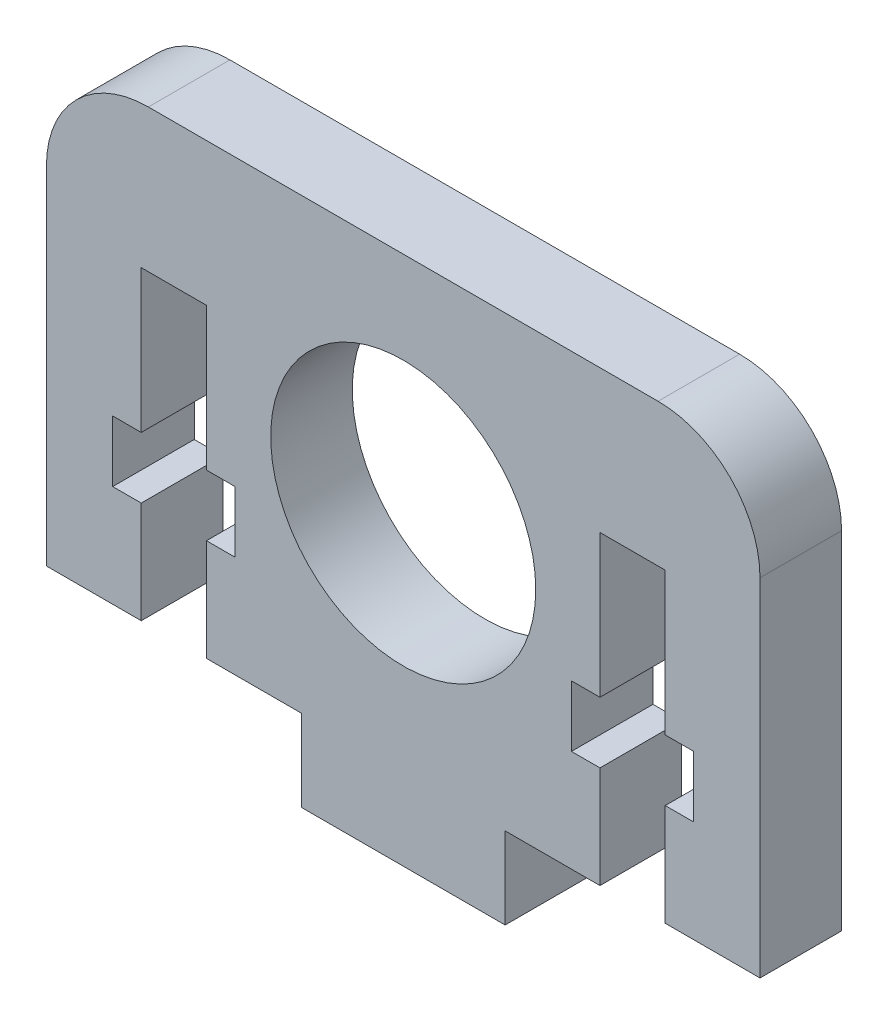
ISO-10303-21;
HEADER;
FILE_DESCRIPTION(('STEP AP214'),'2;1');
FILE_NAME('part.step','',(''),(''),'','','');
FILE_SCHEMA(('AUTOMOTIVE_DESIGN { 1 0 10303 214 1 1 1 1 }'));
ENDSEC;
DATA;
#1=APPLICATION_CONTEXT('core data for automotive mechanical design processes');
#2=APPLICATION_PROTOCOL_DEFINITION('international standard','automotive_design',2000,#1);
#3=PRODUCT_CONTEXT('',#1,'mechanical');
#4=PRODUCT('Part','Part','',(#3));
#5=PRODUCT_RELATED_PRODUCT_CATEGORY('part','',(#4));
#6=PRODUCT_DEFINITION_FORMATION('','',#4);
#7=PRODUCT_DEFINITION_CONTEXT('part definition',#1,'design');
#8=PRODUCT_DEFINITION('design','',#6,#7);
#9=PRODUCT_DEFINITION_SHAPE('','',#8);
#10=(LENGTH_UNIT() NAMED_UNIT(*) SI_UNIT(.MILLI.,.METRE.));
#11=(NAMED_UNIT(*) PLANE_ANGLE_UNIT() SI_UNIT($,.RADIAN.));
#12=(NAMED_UNIT(*) SI_UNIT($,.STERADIAN.) SOLID_ANGLE_UNIT());
#13=UNCERTAINTY_MEASURE_WITH_UNIT(LENGTH_MEASURE(1.E-05),#10,'distance_accuracy_value','');
#14=(GEOMETRIC_REPRESENTATION_CONTEXT(3) GLOBAL_UNCERTAINTY_ASSIGNED_CONTEXT((#13)) GLOBAL_UNIT_ASSIGNED_CONTEXT((#10,
#11,#12)) REPRESENTATION_CONTEXT('',''));
#15=CARTESIAN_POINT('',(0.,0.,0.));
#16=DIRECTION('',(0.,0.,1.));
#17=DIRECTION('',(1.,0.,0.));
#18=AXIS2_PLACEMENT_3D('',#15,#16,#17);
#19=CARTESIAN_POINT('',(-17.5,-11.,4.));
#20=DIRECTION('',(0.,1.,0.));
#21=DIRECTION('',(-1.,0.,0.));
#22=AXIS2_PLACEMENT_3D('',#19,#20,#21);
#23=PLANE('',#22);
#24=DIRECTION('',(1.,0.,0.));
#25=VECTOR('',#24,1.);
#26=CARTESIAN_POINT('',(-17.5,-11.,4.));
#27=LINE('',#26,#25);
#28=CARTESIAN_POINT('',(-9.64999999999999,-11.,4.));
#29=VERTEX_POINT('',#28);
#30=CARTESIAN_POINT('',(-5.,-11.,4.));
#31=VERTEX_POINT('',#30);
#32=EDGE_CURVE('E464',#29,#31,#27,.T.);
#33=ORIENTED_EDGE('',*,*,#32,.F.);
#34=DIRECTION('',(0.,0.,1.));
#35=VECTOR('',#34,1.);
#36=CARTESIAN_POINT('',(-9.64999999999999,-11.,0.));
#37=LINE('',#36,#35);
#38=CARTESIAN_POINT('',(-9.64999999999999,-11.,0.));
#39=VERTEX_POINT('',#38);
#40=EDGE_CURVE('E315',#39,#29,#37,.T.);
#41=ORIENTED_EDGE('',*,*,#40,.F.);
#42=DIRECTION('',(1.,0.,0.));
#43=VECTOR('',#42,1.);
#44=CARTESIAN_POINT('',(-17.5,-11.,0.));
#45=LINE('',#44,#43);
#46=CARTESIAN_POINT('',(-5.,-11.,0.));
#47=VERTEX_POINT('',#46);
#48=EDGE_CURVE('E484',#39,#47,#45,.T.);
#49=ORIENTED_EDGE('',*,*,#48,.T.);
#50=DIRECTION('',(0.,0.,-1.));
#51=VECTOR('',#50,1.);
#52=CARTESIAN_POINT('',(-5.,-11.,4.));
#53=LINE('',#52,#51);
#54=EDGE_CURVE('E507',#31,#47,#53,.T.);
#55=ORIENTED_EDGE('',*,*,#54,.F.);
#56=EDGE_LOOP('',(#33,#41,#49,#55));
#57=FACE_BOUND('',#56,.T.);
#58=ADVANCED_FACE('F33',(#57),#23,.F.);
#59=CARTESIAN_POINT('',(5.,-11.,4.));
#60=DIRECTION('',(0.,1.,0.));
#61=DIRECTION('',(-1.,0.,0.));
#62=AXIS2_PLACEMENT_3D('',#59,#60,#61);
#63=PLANE('',#62);
#64=DIRECTION('',(1.,0.,0.));
#65=VECTOR('',#64,1.);
#66=CARTESIAN_POINT('',(5.,-11.,0.));
#67=LINE('',#66,#65);
#68=CARTESIAN_POINT('',(5.,-11.,0.));
#69=VERTEX_POINT('',#68);
#70=CARTESIAN_POINT('',(9.65,-11.,0.));
#71=VERTEX_POINT('',#70);
#72=EDGE_CURVE('E460',#69,#71,#67,.T.);
#73=ORIENTED_EDGE('',*,*,#72,.T.);
#74=DIRECTION('',(0.,0.,1.));
#75=VECTOR('',#74,1.);
#76=CARTESIAN_POINT('',(9.65,-11.,0.));
#77=LINE('',#76,#75);
#78=CARTESIAN_POINT('',(9.65,-11.,4.));
#79=VERTEX_POINT('',#78);
#80=EDGE_CURVE('E340',#71,#79,#77,.T.);
#81=ORIENTED_EDGE('',*,*,#80,.T.);
#82=DIRECTION('',(1.,0.,0.));
#83=VECTOR('',#82,1.);
#84=CARTESIAN_POINT('',(5.,-11.,4.));
#85=LINE('',#84,#83);
#86=CARTESIAN_POINT('',(5.,-11.,4.));
#87=VERTEX_POINT('',#86);
#88=EDGE_CURVE('E475',#87,#79,#85,.T.);
#89=ORIENTED_EDGE('',*,*,#88,.F.);
#90=DIRECTION('',(0.,0.,-1.));
#91=VECTOR('',#90,1.);
#92=CARTESIAN_POINT('',(5.,-11.,4.));
#93=LINE('',#92,#91);
#94=EDGE_CURVE('E498',#87,#69,#93,.T.);
#95=ORIENTED_EDGE('',*,*,#94,.T.);
#96=EDGE_LOOP('',(#73,#81,#89,#95));
#97=FACE_BOUND('',#96,.T.);
#98=ADVANCED_FACE('F586',(#97),#63,.F.);
#99=CARTESIAN_POINT('',(0.,0.,4.));
#100=DIRECTION('',(0.,0.,1.));
#101=DIRECTION('',(1.,0.,0.));
#102=AXIS2_PLACEMENT_3D('',#99,#100,#101);
#103=PLANE('',#102);
#104=DIRECTION('',(-1.,0.,0.));
#105=VECTOR('',#104,1.);
#106=CARTESIAN_POINT('',(-17.5,11.,4.));
#107=LINE('',#106,#105);
#108=CARTESIAN_POINT('',(12.5,11.,4.));
#109=VERTEX_POINT('',#108);
#110=CARTESIAN_POINT('',(-12.5,11.,4.));
#111=VERTEX_POINT('',#110);
#112=EDGE_CURVE('E459',#109,#111,#107,.T.);
#113=ORIENTED_EDGE('',*,*,#112,.T.);
#114=CARTESIAN_POINT('',(-12.5,6.,4.));
#115=DIRECTION('',(0.,0.,1.));
#116=DIRECTION('',(1.,0.,0.));
#117=AXIS2_PLACEMENT_3D('',#114,#115,#116);
#118=CIRCLE('',#117,5.);
#119=CARTESIAN_POINT('',(-17.5,6.,4.));
#120=VERTEX_POINT('',#119);
#121=EDGE_CURVE('E41',#111,#120,#118,.T.);
#122=ORIENTED_EDGE('',*,*,#121,.T.);
#123=DIRECTION('',(0.,-1.,0.));
#124=VECTOR('',#123,1.);
#125=CARTESIAN_POINT('',(-17.5,11.,4.));
#126=LINE('',#125,#124);
#127=CARTESIAN_POINT('',(-17.5,-11.,4.));
#128=VERTEX_POINT('',#127);
#129=EDGE_CURVE('E462',#120,#128,#126,.T.);
#130=ORIENTED_EDGE('',*,*,#129,.T.);
#131=CARTESIAN_POINT('',(-12.85,-11.,4.));
#132=VERTEX_POINT('',#131);
#133=EDGE_CURVE('E465',#128,#132,#27,.T.);
#134=ORIENTED_EDGE('',*,*,#133,.T.);
#135=DIRECTION('',(0.,-1.,0.));
#136=VECTOR('',#135,1.);
#137=CARTESIAN_POINT('',(-12.85,-11.,4.));
#138=LINE('',#137,#136);
#139=CARTESIAN_POINT('',(-12.85,-6.,4.));
#140=VERTEX_POINT('',#139);
#141=EDGE_CURVE('E366',#140,#132,#138,.T.);
#142=ORIENTED_EDGE('',*,*,#141,.F.);
#143=DIRECTION('',(1.,0.,0.));
#144=VECTOR('',#143,1.);
#145=CARTESIAN_POINT('',(-12.85,-6.,4.));
#146=LINE('',#145,#144);
#147=CARTESIAN_POINT('',(-14.25,-6.,4.));
#148=VERTEX_POINT('',#147);
#149=EDGE_CURVE('E424',#148,#140,#146,.T.);
#150=ORIENTED_EDGE('',*,*,#149,.F.);
#151=DIRECTION('',(0.,-1.,0.));
#152=VECTOR('',#151,1.);
#153=CARTESIAN_POINT('',(-14.25,-6.,4.));
#154=LINE('',#153,#152);
#155=CARTESIAN_POINT('',(-14.25,-3.,4.));
#156=VERTEX_POINT('',#155);
#157=EDGE_CURVE('E421',#156,#148,#154,.T.);
#158=ORIENTED_EDGE('',*,*,#157,.F.);
#159=DIRECTION('',(-1.,0.,0.));
#160=VECTOR('',#159,1.);
#161=CARTESIAN_POINT('',(-14.25,-3.,4.));
#162=LINE('',#161,#160);
#163=CARTESIAN_POINT('',(-12.85,-3.,4.));
#164=VERTEX_POINT('',#163);
#165=EDGE_CURVE('E418',#164,#156,#162,.T.);
#166=ORIENTED_EDGE('',*,*,#165,.F.);
#167=DIRECTION('',(0.,-1.,0.));
#168=VECTOR('',#167,1.);
#169=CARTESIAN_POINT('',(-12.85,-3.,4.));
#170=LINE('',#169,#168);
#171=CARTESIAN_POINT('',(-12.85,4.,4.));
#172=VERTEX_POINT('',#171);
#173=EDGE_CURVE('E415',#172,#164,#170,.T.);
#174=ORIENTED_EDGE('',*,*,#173,.F.);
#175=DIRECTION('',(-1.,0.,0.));
#176=VECTOR('',#175,1.);
#177=CARTESIAN_POINT('',(-12.85,4.,4.));
#178=LINE('',#177,#176);
#179=CARTESIAN_POINT('',(-9.65,4.,4.));
#180=VERTEX_POINT('',#179);
#181=EDGE_CURVE('E412',#180,#172,#178,.T.);
#182=ORIENTED_EDGE('',*,*,#181,.F.);
#183=DIRECTION('',(0.,1.,0.));
#184=VECTOR('',#183,1.);
#185=CARTESIAN_POINT('',(-9.64999999999999,-3.,4.));
#186=LINE('',#185,#184);
#187=CARTESIAN_POINT('',(-9.64999999999999,-3.,4.));
#188=VERTEX_POINT('',#187);
#189=EDGE_CURVE('E409',#188,#180,#186,.T.);
#190=ORIENTED_EDGE('',*,*,#189,.F.);
#191=DIRECTION('',(-1.,0.,0.));
#192=VECTOR('',#191,1.);
#193=CARTESIAN_POINT('',(-8.24999999999999,-3.,4.));
#194=LINE('',#193,#192);
#195=CARTESIAN_POINT('',(-8.24999999999999,-3.,4.));
#196=VERTEX_POINT('',#195);
#197=EDGE_CURVE('E406',#196,#188,#194,.T.);
#198=ORIENTED_EDGE('',*,*,#197,.F.);
#199=DIRECTION('',(0.,1.,0.));
#200=VECTOR('',#199,1.);
#201=CARTESIAN_POINT('',(-8.24999999999999,-6.,4.));
#202=LINE('',#201,#200);
#203=CARTESIAN_POINT('',(-8.24999999999999,-6.,4.));
#204=VERTEX_POINT('',#203);
#205=EDGE_CURVE('E403',#204,#196,#202,.T.);
#206=ORIENTED_EDGE('',*,*,#205,.F.);
#207=DIRECTION('',(1.,0.,0.));
#208=VECTOR('',#207,1.);
#209=CARTESIAN_POINT('',(-9.64999999999999,-6.,4.));
#210=LINE('',#209,#208);
#211=CARTESIAN_POINT('',(-9.64999999999999,-6.,4.));
#212=VERTEX_POINT('',#211);
#213=EDGE_CURVE('E400',#212,#204,#210,.T.);
#214=ORIENTED_EDGE('',*,*,#213,.F.);
#215=DIRECTION('',(0.,1.,0.));
#216=VECTOR('',#215,1.);
#217=CARTESIAN_POINT('',(-9.64999999999999,-11.,4.));
#218=LINE('',#217,#216);
#219=EDGE_CURVE('E397',#29,#212,#218,.T.);
#220=ORIENTED_EDGE('',*,*,#219,.F.);
#221=ORIENTED_EDGE('',*,*,#32,.T.);
#222=DIRECTION('',(0.,-1.,0.));
#223=VECTOR('',#222,1.);
#224=CARTESIAN_POINT('',(-5.,-11.,4.));
#225=LINE('',#224,#223);
#226=CARTESIAN_POINT('',(-5.,-15.,4.));
#227=VERTEX_POINT('',#226);
#228=EDGE_CURVE('E468',#31,#227,#225,.T.);
#229=ORIENTED_EDGE('',*,*,#228,.T.);
#230=DIRECTION('',(1.,0.,0.));
#231=VECTOR('',#230,1.);
#232=CARTESIAN_POINT('',(-5.,-15.,4.));
#233=LINE('',#232,#231);
#234=CARTESIAN_POINT('',(5.,-15.,4.));
#235=VERTEX_POINT('',#234);
#236=EDGE_CURVE('E470',#227,#235,#233,.T.);
#237=ORIENTED_EDGE('',*,*,#236,.T.);
#238=DIRECTION('',(0.,1.,0.));
#239=VECTOR('',#238,1.);
#240=CARTESIAN_POINT('',(5.,-11.,4.));
#241=LINE('',#240,#239);
#242=EDGE_CURVE('E472',#235,#87,#241,.T.);
#243=ORIENTED_EDGE('',*,*,#242,.T.);
#244=ORIENTED_EDGE('',*,*,#88,.T.);
#245=DIRECTION('',(0.,-1.,0.));
#246=VECTOR('',#245,1.);
#247=CARTESIAN_POINT('',(9.65,-11.,4.));
#248=LINE('',#247,#246);
#249=CARTESIAN_POINT('',(9.65,-6.,4.));
#250=VERTEX_POINT('',#249);
#251=EDGE_CURVE('E283',#250,#79,#248,.T.);
#252=ORIENTED_EDGE('',*,*,#251,.F.);
#253=DIRECTION('',(1.,0.,0.));
#254=VECTOR('',#253,1.);
#255=CARTESIAN_POINT('',(9.65,-6.,4.));
#256=LINE('',#255,#254);
#257=CARTESIAN_POINT('',(8.25,-6.,4.));
#258=VERTEX_POINT('',#257);
#259=EDGE_CURVE('E285',#258,#250,#256,.T.);
#260=ORIENTED_EDGE('',*,*,#259,.F.);
#261=DIRECTION('',(0.,-1.,0.));
#262=VECTOR('',#261,1.);
#263=CARTESIAN_POINT('',(8.25,-6.,4.));
#264=LINE('',#263,#262);
#265=CARTESIAN_POINT('',(8.25,-3.,4.));
#266=VERTEX_POINT('',#265);
#267=EDGE_CURVE('E335',#266,#258,#264,.T.);
#268=ORIENTED_EDGE('',*,*,#267,.F.);
#269=DIRECTION('',(-1.,0.,0.));
#270=VECTOR('',#269,1.);
#271=CARTESIAN_POINT('',(8.25,-3.,4.));
#272=LINE('',#271,#270);
#273=CARTESIAN_POINT('',(9.65,-3.,4.));
#274=VERTEX_POINT('',#273);
#275=EDGE_CURVE('E332',#274,#266,#272,.T.);
#276=ORIENTED_EDGE('',*,*,#275,.F.);
#277=DIRECTION('',(0.,-1.,0.));
#278=VECTOR('',#277,1.);
#279=CARTESIAN_POINT('',(9.65,-3.,4.));
#280=LINE('',#279,#278);
#281=CARTESIAN_POINT('',(9.65,4.,4.));
#282=VERTEX_POINT('',#281);
#283=EDGE_CURVE('E329',#282,#274,#280,.T.);
#284=ORIENTED_EDGE('',*,*,#283,.F.);
#285=DIRECTION('',(-1.,0.,0.));
#286=VECTOR('',#285,1.);
#287=CARTESIAN_POINT('',(12.85,4.,4.));
#288=LINE('',#287,#286);
#289=CARTESIAN_POINT('',(12.85,4.,4.));
#290=VERTEX_POINT('',#289);
#291=EDGE_CURVE('E326',#290,#282,#288,.T.);
#292=ORIENTED_EDGE('',*,*,#291,.F.);
#293=DIRECTION('',(0.,1.,0.));
#294=VECTOR('',#293,1.);
#295=CARTESIAN_POINT('',(12.85,-3.,4.));
#296=LINE('',#295,#294);
#297=CARTESIAN_POINT('',(12.85,-3.,4.));
#298=VERTEX_POINT('',#297);
#299=EDGE_CURVE('E323',#298,#290,#296,.T.);
#300=ORIENTED_EDGE('',*,*,#299,.F.);
#301=DIRECTION('',(-1.,0.,0.));
#302=VECTOR('',#301,1.);
#303=CARTESIAN_POINT('',(14.25,-3.,4.));
#304=LINE('',#303,#302);
#305=CARTESIAN_POINT('',(14.25,-3.,4.));
#306=VERTEX_POINT('',#305);
#307=EDGE_CURVE('E320',#306,#298,#304,.T.);
#308=ORIENTED_EDGE('',*,*,#307,.F.);
#309=DIRECTION('',(0.,1.,0.));
#310=VECTOR('',#309,1.);
#311=CARTESIAN_POINT('',(14.25,-6.,4.));
#312=LINE('',#311,#310);
#313=CARTESIAN_POINT('',(14.25,-6.,4.));
#314=VERTEX_POINT('',#313);
#315=EDGE_CURVE('E317',#314,#306,#312,.T.);
#316=ORIENTED_EDGE('',*,*,#315,.F.);
#317=DIRECTION('',(1.,0.,0.));
#318=VECTOR('',#317,1.);
#319=CARTESIAN_POINT('',(12.85,-6.,4.));
#320=LINE('',#319,#318);
#321=CARTESIAN_POINT('',(12.85,-6.,4.));
#322=VERTEX_POINT('',#321);
#323=EDGE_CURVE('E314',#322,#314,#320,.T.);
#324=ORIENTED_EDGE('',*,*,#323,.F.);
#325=DIRECTION('',(0.,1.,0.));
#326=VECTOR('',#325,1.);
#327=CARTESIAN_POINT('',(12.85,-11.,4.));
#328=LINE('',#327,#326);
#329=CARTESIAN_POINT('',(12.85,-11.,4.));
#330=VERTEX_POINT('',#329);
#331=EDGE_CURVE('E262',#330,#322,#328,.T.);
#332=ORIENTED_EDGE('',*,*,#331,.F.);
#333=CARTESIAN_POINT('',(17.5,-11.,4.));
#334=VERTEX_POINT('',#333);
#335=EDGE_CURVE('E474',#330,#334,#85,.T.);
#336=ORIENTED_EDGE('',*,*,#335,.T.);
#337=DIRECTION('',(0.,1.,0.));
#338=VECTOR('',#337,1.);
#339=CARTESIAN_POINT('',(17.5,11.,4.));
#340=LINE('',#339,#338);
#341=CARTESIAN_POINT('',(17.5,6.,4.));
#342=VERTEX_POINT('',#341);
#343=EDGE_CURVE('E457',#334,#342,#340,.T.);
#344=ORIENTED_EDGE('',*,*,#343,.T.);
#345=CARTESIAN_POINT('',(12.5,6.,4.));
#346=DIRECTION('',(0.,0.,1.));
#347=DIRECTION('',(1.,0.,0.));
#348=AXIS2_PLACEMENT_3D('',#345,#346,#347);
#349=CIRCLE('',#348,5.);
#350=EDGE_CURVE('E524',#342,#109,#349,.T.);
#351=ORIENTED_EDGE('',*,*,#350,.T.);
#352=EDGE_LOOP('',(#113,#122,#130,#134,#142,#150,#158,#166,#174,#182,#190,#198,#206,#214,#220,
#221,#229,#237,#243,#244,#252,#260,#268,#276,#284,#292,#300,#308,#316,#324,#332,#336,#344,#351));
#353=FACE_BOUND('',#352,.T.);
#354=CARTESIAN_POINT('',(0.,0.,4.));
#355=DIRECTION('',(0.,0.,1.));
#356=DIRECTION('',(1.,0.,0.));
#357=AXIS2_PLACEMENT_3D('',#354,#355,#356);
#358=CIRCLE('',#357,6.5);
#359=CARTESIAN_POINT('',(6.5,0.,4.));
#360=VERTEX_POINT('',#359);
#361=EDGE_CURVE('E451',#360,#360,#358,.T.);
#362=ORIENTED_EDGE('',*,*,#361,.F.);
#363=EDGE_LOOP('',(#362));
#364=FACE_BOUND('',#363,.T.);
#365=ADVANCED_FACE('F528',(#353,#364),#103,.T.);
#366=CARTESIAN_POINT('',(0.,0.,0.));
#367=DIRECTION('',(0.,0.,1.));
#368=DIRECTION('',(1.,0.,0.));
#369=AXIS2_PLACEMENT_3D('',#366,#367,#368);
#370=PLANE('',#369);
#371=DIRECTION('',(0.,-1.,0.));
#372=VECTOR('',#371,1.);
#373=CARTESIAN_POINT('',(-17.5,11.,0.));
#374=LINE('',#373,#372);
#375=CARTESIAN_POINT('',(-17.5,6.,0.));
#376=VERTEX_POINT('',#375);
#377=CARTESIAN_POINT('',(-17.5,-11.,0.));
#378=VERTEX_POINT('',#377);
#379=EDGE_CURVE('E482',#376,#378,#374,.T.);
#380=ORIENTED_EDGE('',*,*,#379,.F.);
#381=CARTESIAN_POINT('',(-12.5,6.,0.));
#382=DIRECTION('',(0.,0.,1.));
#383=DIRECTION('',(1.,0.,0.));
#384=AXIS2_PLACEMENT_3D('',#381,#382,#383);
#385=CIRCLE('',#384,5.);
#386=CARTESIAN_POINT('',(-12.5,11.,0.));
#387=VERTEX_POINT('',#386);
#388=EDGE_CURVE('E518',#376,#387,#385,.F.);
#389=ORIENTED_EDGE('',*,*,#388,.T.);
#390=DIRECTION('',(-1.,0.,0.));
#391=VECTOR('',#390,1.);
#392=CARTESIAN_POINT('',(-17.5,11.,0.));
#393=LINE('',#392,#391);
#394=CARTESIAN_POINT('',(12.5,11.,0.));
#395=VERTEX_POINT('',#394);
#396=EDGE_CURVE('E480',#395,#387,#393,.T.);
#397=ORIENTED_EDGE('',*,*,#396,.F.);
#398=CARTESIAN_POINT('',(12.5,6.,0.));
#399=DIRECTION('',(0.,0.,1.));
#400=DIRECTION('',(1.,0.,0.));
#401=AXIS2_PLACEMENT_3D('',#398,#399,#400);
#402=CIRCLE('',#401,5.);
#403=CARTESIAN_POINT('',(17.5,6.,0.));
#404=VERTEX_POINT('',#403);
#405=EDGE_CURVE('E516',#395,#404,#402,.F.);
#406=ORIENTED_EDGE('',*,*,#405,.T.);
#407=DIRECTION('',(0.,1.,0.));
#408=VECTOR('',#407,1.);
#409=CARTESIAN_POINT('',(17.5,11.,0.));
#410=LINE('',#409,#408);
#411=CARTESIAN_POINT('',(17.5,-11.,0.));
#412=VERTEX_POINT('',#411);
#413=EDGE_CURVE('E454',#412,#404,#410,.T.);
#414=ORIENTED_EDGE('',*,*,#413,.F.);
#415=CARTESIAN_POINT('',(12.85,-11.,0.));
#416=VERTEX_POINT('',#415);
#417=EDGE_CURVE('E282',#416,#412,#67,.T.);
#418=ORIENTED_EDGE('',*,*,#417,.F.);
#419=DIRECTION('',(0.,1.,0.));
#420=VECTOR('',#419,1.);
#421=CARTESIAN_POINT('',(12.85,-11.,0.));
#422=LINE('',#421,#420);
#423=CARTESIAN_POINT('',(12.85,-6.,0.));
#424=VERTEX_POINT('',#423);
#425=EDGE_CURVE('E259',#416,#424,#422,.T.);
#426=ORIENTED_EDGE('',*,*,#425,.T.);
#427=DIRECTION('',(1.,0.,0.));
#428=VECTOR('',#427,1.);
#429=CARTESIAN_POINT('',(12.85,-6.,0.));
#430=LINE('',#429,#428);
#431=CARTESIAN_POINT('',(14.25,-6.,0.));
#432=VERTEX_POINT('',#431);
#433=EDGE_CURVE('E270',#424,#432,#430,.T.);
#434=ORIENTED_EDGE('',*,*,#433,.T.);
#435=DIRECTION('',(0.,1.,0.));
#436=VECTOR('',#435,1.);
#437=CARTESIAN_POINT('',(14.25,-6.,0.));
#438=LINE('',#437,#436);
#439=CARTESIAN_POINT('',(14.25,-3.,0.));
#440=VERTEX_POINT('',#439);
#441=EDGE_CURVE('E275',#432,#440,#438,.T.);
#442=ORIENTED_EDGE('',*,*,#441,.T.);
#443=DIRECTION('',(-1.,0.,0.));
#444=VECTOR('',#443,1.);
#445=CARTESIAN_POINT('',(14.25,-3.,0.));
#446=LINE('',#445,#444);
#447=CARTESIAN_POINT('',(12.85,-3.,0.));
#448=VERTEX_POINT('',#447);
#449=EDGE_CURVE('E289',#440,#448,#446,.T.);
#450=ORIENTED_EDGE('',*,*,#449,.T.);
#451=DIRECTION('',(0.,1.,0.));
#452=VECTOR('',#451,1.);
#453=CARTESIAN_POINT('',(12.85,-3.,0.));
#454=LINE('',#453,#452);
#455=CARTESIAN_POINT('',(12.85,4.,0.));
#456=VERTEX_POINT('',#455);
#457=EDGE_CURVE('E292',#448,#456,#454,.T.);
#458=ORIENTED_EDGE('',*,*,#457,.T.);
#459=DIRECTION('',(-1.,0.,0.));
#460=VECTOR('',#459,1.);
#461=CARTESIAN_POINT('',(12.85,4.,0.));
#462=LINE('',#461,#460);
#463=CARTESIAN_POINT('',(9.65,4.,0.));
#464=VERTEX_POINT('',#463);
#465=EDGE_CURVE('E295',#456,#464,#462,.T.);
#466=ORIENTED_EDGE('',*,*,#465,.T.);
#467=DIRECTION('',(0.,-1.,0.));
#468=VECTOR('',#467,1.);
#469=CARTESIAN_POINT('',(9.65,-3.,0.));
#470=LINE('',#469,#468);
#471=CARTESIAN_POINT('',(9.65,-3.,0.));
#472=VERTEX_POINT('',#471);
#473=EDGE_CURVE('E298',#464,#472,#470,.T.);
#474=ORIENTED_EDGE('',*,*,#473,.T.);
#475=DIRECTION('',(-1.,0.,0.));
#476=VECTOR('',#475,1.);
#477=CARTESIAN_POINT('',(8.25,-3.,0.));
#478=LINE('',#477,#476);
#479=CARTESIAN_POINT('',(8.25,-3.,0.));
#480=VERTEX_POINT('',#479);
#481=EDGE_CURVE('E301',#472,#480,#478,.T.);
#482=ORIENTED_EDGE('',*,*,#481,.T.);
#483=DIRECTION('',(0.,-1.,0.));
#484=VECTOR('',#483,1.);
#485=CARTESIAN_POINT('',(8.25,-6.,0.));
#486=LINE('',#485,#484);
#487=CARTESIAN_POINT('',(8.25,-6.,0.));
#488=VERTEX_POINT('',#487);
#489=EDGE_CURVE('E304',#480,#488,#486,.T.);
#490=ORIENTED_EDGE('',*,*,#489,.T.);
#491=DIRECTION('',(1.,0.,0.));
#492=VECTOR('',#491,1.);
#493=CARTESIAN_POINT('',(9.65,-6.,0.));
#494=LINE('',#493,#492);
#495=CARTESIAN_POINT('',(9.65,-6.,0.));
#496=VERTEX_POINT('',#495);
#497=EDGE_CURVE('E307',#488,#496,#494,.T.);
#498=ORIENTED_EDGE('',*,*,#497,.T.);
#499=DIRECTION('',(0.,-1.,0.));
#500=VECTOR('',#499,1.);
#501=CARTESIAN_POINT('',(9.65,-11.,0.));
#502=LINE('',#501,#500);
#503=EDGE_CURVE('E310',#496,#71,#502,.T.);
#504=ORIENTED_EDGE('',*,*,#503,.T.);
#505=ORIENTED_EDGE('',*,*,#72,.F.);
#506=DIRECTION('',(0.,1.,0.));
#507=VECTOR('',#506,1.);
#508=CARTESIAN_POINT('',(5.,-11.,0.));
#509=LINE('',#508,#507);
#510=CARTESIAN_POINT('',(5.,-15.,0.));
#511=VERTEX_POINT('',#510);
#512=EDGE_CURVE('E492',#511,#69,#509,.T.);
#513=ORIENTED_EDGE('',*,*,#512,.F.);
#514=DIRECTION('',(1.,0.,0.));
#515=VECTOR('',#514,1.);
#516=CARTESIAN_POINT('',(-5.,-15.,0.));
#517=LINE('',#516,#515);
#518=CARTESIAN_POINT('',(-5.,-15.,0.));
#519=VERTEX_POINT('',#518);
#520=EDGE_CURVE('E490',#519,#511,#517,.T.);
#521=ORIENTED_EDGE('',*,*,#520,.F.);
#522=DIRECTION('',(0.,-1.,0.));
#523=VECTOR('',#522,1.);
#524=CARTESIAN_POINT('',(-5.,-11.,0.));
#525=LINE('',#524,#523);
#526=EDGE_CURVE('E488',#47,#519,#525,.T.);
#527=ORIENTED_EDGE('',*,*,#526,.F.);
#528=ORIENTED_EDGE('',*,*,#48,.F.);
#529=DIRECTION('',(0.,1.,0.));
#530=VECTOR('',#529,1.);
#531=CARTESIAN_POINT('',(-9.64999999999999,-11.,0.));
#532=LINE('',#531,#530);
#533=CARTESIAN_POINT('',(-9.64999999999999,-6.,0.));
#534=VERTEX_POINT('',#533);
#535=EDGE_CURVE('E362',#39,#534,#532,.T.);
#536=ORIENTED_EDGE('',*,*,#535,.T.);
#537=DIRECTION('',(1.,0.,0.));
#538=VECTOR('',#537,1.);
#539=CARTESIAN_POINT('',(-9.64999999999999,-6.,0.));
#540=LINE('',#539,#538);
#541=CARTESIAN_POINT('',(-8.24999999999999,-6.,0.));
#542=VERTEX_POINT('',#541);
#543=EDGE_CURVE('E365',#534,#542,#540,.T.);
#544=ORIENTED_EDGE('',*,*,#543,.T.);
#545=DIRECTION('',(0.,1.,0.));
#546=VECTOR('',#545,1.);
#547=CARTESIAN_POINT('',(-8.24999999999999,-6.,0.));
#548=LINE('',#547,#546);
#549=CARTESIAN_POINT('',(-8.24999999999999,-3.,0.));
#550=VERTEX_POINT('',#549);
#551=EDGE_CURVE('E369',#542,#550,#548,.T.);
#552=ORIENTED_EDGE('',*,*,#551,.T.);
#553=DIRECTION('',(-1.,0.,0.));
#554=VECTOR('',#553,1.);
#555=CARTESIAN_POINT('',(-8.24999999999999,-3.,0.));
#556=LINE('',#555,#554);
#557=CARTESIAN_POINT('',(-9.64999999999999,-3.,0.));
#558=VERTEX_POINT('',#557);
#559=EDGE_CURVE('E372',#550,#558,#556,.T.);
#560=ORIENTED_EDGE('',*,*,#559,.T.);
#561=DIRECTION('',(0.,1.,0.));
#562=VECTOR('',#561,1.);
#563=CARTESIAN_POINT('',(-9.64999999999999,-3.,0.));
#564=LINE('',#563,#562);
#565=CARTESIAN_POINT('',(-9.65,4.,0.));
#566=VERTEX_POINT('',#565);
#567=EDGE_CURVE('E375',#558,#566,#564,.T.);
#568=ORIENTED_EDGE('',*,*,#567,.T.);
#569=DIRECTION('',(-1.,0.,0.));
#570=VECTOR('',#569,1.);
#571=CARTESIAN_POINT('',(-12.85,4.,0.));
#572=LINE('',#571,#570);
#573=CARTESIAN_POINT('',(-12.85,4.,0.));
#574=VERTEX_POINT('',#573);
#575=EDGE_CURVE('E378',#566,#574,#572,.T.);
#576=ORIENTED_EDGE('',*,*,#575,.T.);
#577=DIRECTION('',(0.,-1.,0.));
#578=VECTOR('',#577,1.);
#579=CARTESIAN_POINT('',(-12.85,-3.,0.));
#580=LINE('',#579,#578);
#581=CARTESIAN_POINT('',(-12.85,-3.,0.));
#582=VERTEX_POINT('',#581);
#583=EDGE_CURVE('E381',#574,#582,#580,.T.);
#584=ORIENTED_EDGE('',*,*,#583,.T.);
#585=DIRECTION('',(-1.,0.,0.));
#586=VECTOR('',#585,1.);
#587=CARTESIAN_POINT('',(-14.25,-3.,0.));
#588=LINE('',#587,#586);
#589=CARTESIAN_POINT('',(-14.25,-3.,0.));
#590=VERTEX_POINT('',#589);
#591=EDGE_CURVE('E384',#582,#590,#588,.T.);
#592=ORIENTED_EDGE('',*,*,#591,.T.);
#593=DIRECTION('',(0.,-1.,0.));
#594=VECTOR('',#593,1.);
#595=CARTESIAN_POINT('',(-14.25,-6.,0.));
#596=LINE('',#595,#594);
#597=CARTESIAN_POINT('',(-14.25,-6.,0.));
#598=VERTEX_POINT('',#597);
#599=EDGE_CURVE('E387',#590,#598,#596,.T.);
#600=ORIENTED_EDGE('',*,*,#599,.T.);
#601=DIRECTION('',(1.,0.,0.));
#602=VECTOR('',#601,1.);
#603=CARTESIAN_POINT('',(-12.85,-6.,0.));
#604=LINE('',#603,#602);
#605=CARTESIAN_POINT('',(-12.85,-6.,0.));
#606=VERTEX_POINT('',#605);
#607=EDGE_CURVE('E390',#598,#606,#604,.T.);
#608=ORIENTED_EDGE('',*,*,#607,.T.);
#609=DIRECTION('',(0.,-1.,0.));
#610=VECTOR('',#609,1.);
#611=CARTESIAN_POINT('',(-12.85,-11.,0.));
#612=LINE('',#611,#610);
#613=CARTESIAN_POINT('',(-12.85,-11.,0.));
#614=VERTEX_POINT('',#613);
#615=EDGE_CURVE('E393',#606,#614,#612,.T.);
#616=ORIENTED_EDGE('',*,*,#615,.T.);
#617=EDGE_CURVE('E485',#378,#614,#45,.T.);
#618=ORIENTED_EDGE('',*,*,#617,.F.);
#619=EDGE_LOOP('',(#380,#389,#397,#406,#414,#418,#426,#434,#442,#450,#458,#466,#474,#482,#490,
#498,#504,#505,#513,#521,#527,#528,#536,#544,#552,#560,#568,#576,#584,#592,#600,#608,#616,#618));
#620=FACE_BOUND('',#619,.T.);
#621=CARTESIAN_POINT('',(0.,0.,0.));
#622=DIRECTION('',(0.,0.,1.));
#623=DIRECTION('',(1.,0.,0.));
#624=AXIS2_PLACEMENT_3D('',#621,#622,#623);
#625=CIRCLE('',#624,6.5);
#626=CARTESIAN_POINT('',(6.5,0.,0.));
#627=VERTEX_POINT('',#626);
#628=EDGE_CURVE('E343',#627,#627,#625,.T.);
#629=ORIENTED_EDGE('',*,*,#628,.T.);
#630=EDGE_LOOP('',(#629));
#631=FACE_BOUND('',#630,.T.);
#632=ADVANCED_FACE('F279',(#620,#631),#370,.F.);
#633=CARTESIAN_POINT('',(17.5,11.,4.));
#634=DIRECTION('',(-1.,0.,0.));
#635=DIRECTION('',(0.,-1.,0.));
#636=AXIS2_PLACEMENT_3D('',#633,#634,#635);
#637=PLANE('',#636);
#638=ORIENTED_EDGE('',*,*,#413,.T.);
#639=DIRECTION('',(0.,0.,-1.));
#640=VECTOR('',#639,1.);
#641=CARTESIAN_POINT('',(17.5,6.,4.));
#642=LINE('',#641,#640);
#643=EDGE_CURVE('E11',#404,#342,#642,.F.);
#644=ORIENTED_EDGE('',*,*,#643,.T.);
#645=ORIENTED_EDGE('',*,*,#343,.F.);
#646=DIRECTION('',(0.,0.,-1.));
#647=VECTOR('',#646,1.);
#648=CARTESIAN_POINT('',(17.5,-11.,4.));
#649=LINE('',#648,#647);
#650=EDGE_CURVE('E478',#334,#412,#649,.T.);
#651=ORIENTED_EDGE('',*,*,#650,.T.);
#652=EDGE_LOOP('',(#638,#644,#645,#651));
#653=FACE_BOUND('',#652,.T.);
#654=ADVANCED_FACE('F543',(#653),#637,.F.);
#655=CARTESIAN_POINT('',(-17.5,11.,4.));
#656=DIRECTION('',(0.,-1.,0.));
#657=DIRECTION('',(1.,0.,0.));
#658=AXIS2_PLACEMENT_3D('',#655,#656,#657);
#659=PLANE('',#658);
#660=ORIENTED_EDGE('',*,*,#396,.T.);
#661=DIRECTION('',(0.,0.,-1.));
#662=VECTOR('',#661,1.);
#663=CARTESIAN_POINT('',(-12.5,11.,4.));
#664=LINE('',#663,#662);
#665=EDGE_CURVE('E54',#387,#111,#664,.F.);
#666=ORIENTED_EDGE('',*,*,#665,.T.);
#667=ORIENTED_EDGE('',*,*,#112,.F.);
#668=DIRECTION('',(0.,0.,-1.));
#669=VECTOR('',#668,1.);
#670=CARTESIAN_POINT('',(12.5,11.,4.));
#671=LINE('',#670,#669);
#672=EDGE_CURVE('E520',#109,#395,#671,.T.);
#673=ORIENTED_EDGE('',*,*,#672,.T.);
#674=EDGE_LOOP('',(#660,#666,#667,#673));
#675=FACE_BOUND('',#674,.T.);
#676=ADVANCED_FACE('F539',(#675),#659,.F.);
#677=CARTESIAN_POINT('',(-17.5,11.,4.));
#678=DIRECTION('',(1.,0.,0.));
#679=DIRECTION('',(0.,1.,0.));
#680=AXIS2_PLACEMENT_3D('',#677,#678,#679);
#681=PLANE('',#680);
#682=ORIENTED_EDGE('',*,*,#129,.F.);
#683=DIRECTION('',(0.,0.,-1.));
#684=VECTOR('',#683,1.);
#685=CARTESIAN_POINT('',(-17.5,6.,4.));
#686=LINE('',#685,#684);
#687=EDGE_CURVE('E513',#120,#376,#686,.T.);
#688=ORIENTED_EDGE('',*,*,#687,.T.);
#689=ORIENTED_EDGE('',*,*,#379,.T.);
#690=DIRECTION('',(0.,0.,-1.));
#691=VECTOR('',#690,1.);
#692=CARTESIAN_POINT('',(-17.5,-11.,4.));
#693=LINE('',#692,#691);
#694=EDGE_CURVE('E510',#128,#378,#693,.T.);
#695=ORIENTED_EDGE('',*,*,#694,.F.);
#696=EDGE_LOOP('',(#682,#688,#689,#695));
#697=FACE_BOUND('',#696,.T.);
#698=ADVANCED_FACE('F534',(#697),#681,.F.);
#699=ORIENTED_EDGE('',*,*,#617,.T.);
#700=DIRECTION('',(0.,0.,1.));
#701=VECTOR('',#700,1.);
#702=CARTESIAN_POINT('',(-12.85,-11.,0.));
#703=LINE('',#702,#701);
#704=EDGE_CURVE('E429',#614,#132,#703,.T.);
#705=ORIENTED_EDGE('',*,*,#704,.T.);
#706=ORIENTED_EDGE('',*,*,#133,.F.);
#707=ORIENTED_EDGE('',*,*,#694,.T.);
#708=EDGE_LOOP('',(#699,#705,#706,#707));
#709=FACE_BOUND('',#708,.T.);
#710=ADVANCED_FACE('F651',(#709),#23,.F.);
#711=CARTESIAN_POINT('',(-5.,-11.,4.));
#712=DIRECTION('',(1.,0.,0.));
#713=DIRECTION('',(0.,1.,0.));
#714=AXIS2_PLACEMENT_3D('',#711,#712,#713);
#715=PLANE('',#714);
#716=ORIENTED_EDGE('',*,*,#526,.T.);
#717=DIRECTION('',(0.,0.,-1.));
#718=VECTOR('',#717,1.);
#719=CARTESIAN_POINT('',(-5.,-15.,4.));
#720=LINE('',#719,#718);
#721=EDGE_CURVE('E504',#227,#519,#720,.T.);
#722=ORIENTED_EDGE('',*,*,#721,.F.);
#723=ORIENTED_EDGE('',*,*,#228,.F.);
#724=ORIENTED_EDGE('',*,*,#54,.T.);
#725=EDGE_LOOP('',(#716,#722,#723,#724));
#726=FACE_BOUND('',#725,.T.);
#727=ADVANCED_FACE('F602',(#726),#715,.F.);
#728=CARTESIAN_POINT('',(-5.,-15.,4.));
#729=DIRECTION('',(0.,1.,0.));
#730=DIRECTION('',(-1.,0.,0.));
#731=AXIS2_PLACEMENT_3D('',#728,#729,#730);
#732=PLANE('',#731);
#733=ORIENTED_EDGE('',*,*,#520,.T.);
#734=DIRECTION('',(0.,0.,-1.));
#735=VECTOR('',#734,1.);
#736=CARTESIAN_POINT('',(5.,-15.,4.));
#737=LINE('',#736,#735);
#738=EDGE_CURVE('E501',#235,#511,#737,.T.);
#739=ORIENTED_EDGE('',*,*,#738,.F.);
#740=ORIENTED_EDGE('',*,*,#236,.F.);
#741=ORIENTED_EDGE('',*,*,#721,.T.);
#742=EDGE_LOOP('',(#733,#739,#740,#741));
#743=FACE_BOUND('',#742,.T.);
#744=ADVANCED_FACE('F598',(#743),#732,.F.);
#745=CARTESIAN_POINT('',(5.,-11.,4.));
#746=DIRECTION('',(-1.,0.,0.));
#747=DIRECTION('',(0.,-1.,0.));
#748=AXIS2_PLACEMENT_3D('',#745,#746,#747);
#749=PLANE('',#748);
#750=ORIENTED_EDGE('',*,*,#512,.T.);
#751=ORIENTED_EDGE('',*,*,#94,.F.);
#752=ORIENTED_EDGE('',*,*,#242,.F.);
#753=ORIENTED_EDGE('',*,*,#738,.T.);
#754=EDGE_LOOP('',(#750,#751,#752,#753));
#755=FACE_BOUND('',#754,.T.);
#756=ADVANCED_FACE('F592',(#755),#749,.F.);
#757=ORIENTED_EDGE('',*,*,#335,.F.);
#758=DIRECTION('',(0.,0.,1.));
#759=VECTOR('',#758,1.);
#760=CARTESIAN_POINT('',(12.85,-11.,0.));
#761=LINE('',#760,#759);
#762=EDGE_CURVE('E267',#416,#330,#761,.T.);
#763=ORIENTED_EDGE('',*,*,#762,.F.);
#764=ORIENTED_EDGE('',*,*,#417,.T.);
#765=ORIENTED_EDGE('',*,*,#650,.F.);
#766=EDGE_LOOP('',(#757,#763,#764,#765));
#767=FACE_BOUND('',#766,.T.);
#768=ADVANCED_FACE('F547',(#767),#63,.F.);
#769=CARTESIAN_POINT('',(0.,0.,4.));
#770=DIRECTION('',(0.,0.,-1.));
#771=DIRECTION('',(-1.,0.,0.));
#772=AXIS2_PLACEMENT_3D('',#769,#770,#771);
#773=CYLINDRICAL_SURFACE('',#772,6.5);
#774=ORIENTED_EDGE('',*,*,#361,.T.);
#775=EDGE_LOOP('',(#774));
#776=FACE_BOUND('',#775,.T.);
#777=ORIENTED_EDGE('',*,*,#628,.F.);
#778=EDGE_LOOP('',(#777));
#779=FACE_BOUND('',#778,.T.);
#780=ADVANCED_FACE('F674',(#776,#779),#773,.F.);
#781=CARTESIAN_POINT('',(9.65,-11.,0.));
#782=DIRECTION('',(-1.,0.,0.));
#783=DIRECTION('',(0.,-1.,0.));
#784=AXIS2_PLACEMENT_3D('',#781,#782,#783);
#785=PLANE('',#784);
#786=ORIENTED_EDGE('',*,*,#251,.T.);
#787=ORIENTED_EDGE('',*,*,#80,.F.);
#788=ORIENTED_EDGE('',*,*,#503,.F.);
#789=DIRECTION('',(0.,0.,1.));
#790=VECTOR('',#789,1.);
#791=CARTESIAN_POINT('',(9.65,-6.,0.));
#792=LINE('',#791,#790);
#793=EDGE_CURVE('E344',#496,#250,#792,.T.);
#794=ORIENTED_EDGE('',*,*,#793,.T.);
#795=EDGE_LOOP('',(#786,#787,#788,#794));
#796=FACE_BOUND('',#795,.T.);
#797=ADVANCED_FACE('F583',(#796),#785,.F.);
#798=CARTESIAN_POINT('',(9.65,-6.,0.));
#799=DIRECTION('',(0.,-1.,0.));
#800=DIRECTION('',(0.,0.,-1.));
#801=AXIS2_PLACEMENT_3D('',#798,#799,#800);
#802=PLANE('',#801);
#803=ORIENTED_EDGE('',*,*,#259,.T.);
#804=ORIENTED_EDGE('',*,*,#793,.F.);
#805=ORIENTED_EDGE('',*,*,#497,.F.);
#806=DIRECTION('',(0.,0.,1.));
#807=VECTOR('',#806,1.);
#808=CARTESIAN_POINT('',(8.25,-6.,0.));
#809=LINE('',#808,#807);
#810=EDGE_CURVE('E346',#488,#258,#809,.T.);
#811=ORIENTED_EDGE('',*,*,#810,.T.);
#812=EDGE_LOOP('',(#803,#804,#805,#811));
#813=FACE_BOUND('',#812,.T.);
#814=ADVANCED_FACE('F579',(#813),#802,.F.);
#815=CARTESIAN_POINT('',(8.25,-6.,0.));
#816=DIRECTION('',(-1.,0.,0.));
#817=DIRECTION('',(0.,0.,1.));
#818=AXIS2_PLACEMENT_3D('',#815,#816,#817);
#819=PLANE('',#818);
#820=ORIENTED_EDGE('',*,*,#267,.T.);
#821=ORIENTED_EDGE('',*,*,#810,.F.);
#822=ORIENTED_EDGE('',*,*,#489,.F.);
#823=DIRECTION('',(0.,0.,1.));
#824=VECTOR('',#823,1.);
#825=CARTESIAN_POINT('',(8.25,-3.,0.));
#826=LINE('',#825,#824);
#827=EDGE_CURVE('E348',#480,#266,#826,.T.);
#828=ORIENTED_EDGE('',*,*,#827,.T.);
#829=EDGE_LOOP('',(#820,#821,#822,#828));
#830=FACE_BOUND('',#829,.T.);
#831=ADVANCED_FACE('F574',(#830),#819,.F.);
#832=CARTESIAN_POINT('',(8.25,-3.,0.));
#833=DIRECTION('',(0.,1.,0.));
#834=DIRECTION('',(0.,0.,1.));
#835=AXIS2_PLACEMENT_3D('',#832,#833,#834);
#836=PLANE('',#835);
#837=ORIENTED_EDGE('',*,*,#275,.T.);
#838=ORIENTED_EDGE('',*,*,#827,.F.);
#839=ORIENTED_EDGE('',*,*,#481,.F.);
#840=DIRECTION('',(0.,0.,1.));
#841=VECTOR('',#840,1.);
#842=CARTESIAN_POINT('',(9.65,-3.,0.));
#843=LINE('',#842,#841);
#844=EDGE_CURVE('E350',#472,#274,#843,.T.);
#845=ORIENTED_EDGE('',*,*,#844,.T.);
#846=EDGE_LOOP('',(#837,#838,#839,#845));
#847=FACE_BOUND('',#846,.T.);
#848=ADVANCED_FACE('F570',(#847),#836,.F.);
#849=CARTESIAN_POINT('',(9.65,-3.,0.));
#850=DIRECTION('',(-1.,0.,0.));
#851=DIRECTION('',(0.,0.,1.));
#852=AXIS2_PLACEMENT_3D('',#849,#850,#851);
#853=PLANE('',#852);
#854=ORIENTED_EDGE('',*,*,#283,.T.);
#855=ORIENTED_EDGE('',*,*,#844,.F.);
#856=ORIENTED_EDGE('',*,*,#473,.F.);
#857=DIRECTION('',(0.,0.,1.));
#858=VECTOR('',#857,1.);
#859=CARTESIAN_POINT('',(9.65,4.,0.));
#860=LINE('',#859,#858);
#861=EDGE_CURVE('E352',#464,#282,#860,.T.);
#862=ORIENTED_EDGE('',*,*,#861,.T.);
#863=EDGE_LOOP('',(#854,#855,#856,#862));
#864=FACE_BOUND('',#863,.T.);
#865=ADVANCED_FACE('F566',(#864),#853,.F.);
#866=CARTESIAN_POINT('',(12.85,4.,0.));
#867=DIRECTION('',(0.,1.,0.));
#868=DIRECTION('',(0.,0.,1.));
#869=AXIS2_PLACEMENT_3D('',#866,#867,#868);
#870=PLANE('',#869);
#871=ORIENTED_EDGE('',*,*,#291,.T.);
#872=ORIENTED_EDGE('',*,*,#861,.F.);
#873=ORIENTED_EDGE('',*,*,#465,.F.);
#874=DIRECTION('',(0.,0.,1.));
#875=VECTOR('',#874,1.);
#876=CARTESIAN_POINT('',(12.85,4.,0.));
#877=LINE('',#876,#875);
#878=EDGE_CURVE('E354',#456,#290,#877,.T.);
#879=ORIENTED_EDGE('',*,*,#878,.T.);
#880=EDGE_LOOP('',(#871,#872,#873,#879));
#881=FACE_BOUND('',#880,.T.);
#882=ADVANCED_FACE('F562',(#881),#870,.F.);
#883=CARTESIAN_POINT('',(12.85,-3.,0.));
#884=DIRECTION('',(1.,0.,0.));
#885=DIRECTION('',(0.,1.,0.));
#886=AXIS2_PLACEMENT_3D('',#883,#884,#885);
#887=PLANE('',#886);
#888=ORIENTED_EDGE('',*,*,#299,.T.);
#889=ORIENTED_EDGE('',*,*,#878,.F.);
#890=ORIENTED_EDGE('',*,*,#457,.F.);
#891=DIRECTION('',(0.,0.,1.));
#892=VECTOR('',#891,1.);
#893=CARTESIAN_POINT('',(12.85,-3.,0.));
#894=LINE('',#893,#892);
#895=EDGE_CURVE('E356',#448,#298,#894,.T.);
#896=ORIENTED_EDGE('',*,*,#895,.T.);
#897=EDGE_LOOP('',(#888,#889,#890,#896));
#898=FACE_BOUND('',#897,.T.);
#899=ADVANCED_FACE('F558',(#898),#887,.F.);
#900=CARTESIAN_POINT('',(14.25,-3.,0.));
#901=DIRECTION('',(0.,1.,0.));
#902=DIRECTION('',(0.,0.,1.));
#903=AXIS2_PLACEMENT_3D('',#900,#901,#902);
#904=PLANE('',#903);
#905=ORIENTED_EDGE('',*,*,#307,.T.);
#906=ORIENTED_EDGE('',*,*,#895,.F.);
#907=ORIENTED_EDGE('',*,*,#449,.F.);
#908=DIRECTION('',(0.,0.,1.));
#909=VECTOR('',#908,1.);
#910=CARTESIAN_POINT('',(14.25,-3.,0.));
#911=LINE('',#910,#909);
#912=EDGE_CURVE('E358',#440,#306,#911,.T.);
#913=ORIENTED_EDGE('',*,*,#912,.T.);
#914=EDGE_LOOP('',(#905,#906,#907,#913));
#915=FACE_BOUND('',#914,.T.);
#916=ADVANCED_FACE('F556',(#915),#904,.F.);
#917=CARTESIAN_POINT('',(14.25,-6.,0.));
#918=DIRECTION('',(1.,0.,0.));
#919=DIRECTION('',(0.,0.,-1.));
#920=AXIS2_PLACEMENT_3D('',#917,#918,#919);
#921=PLANE('',#920);
#922=ORIENTED_EDGE('',*,*,#315,.T.);
#923=ORIENTED_EDGE('',*,*,#912,.F.);
#924=ORIENTED_EDGE('',*,*,#441,.F.);
#925=DIRECTION('',(0.,0.,1.));
#926=VECTOR('',#925,1.);
#927=CARTESIAN_POINT('',(14.25,-6.,0.));
#928=LINE('',#927,#926);
#929=EDGE_CURVE('E266',#432,#314,#928,.T.);
#930=ORIENTED_EDGE('',*,*,#929,.T.);
#931=EDGE_LOOP('',(#922,#923,#924,#930));
#932=FACE_BOUND('',#931,.T.);
#933=ADVANCED_FACE('F552',(#932),#921,.F.);
#934=CARTESIAN_POINT('',(12.85,-6.,0.));
#935=DIRECTION('',(0.,-1.,0.));
#936=DIRECTION('',(0.,0.,-1.));
#937=AXIS2_PLACEMENT_3D('',#934,#935,#936);
#938=PLANE('',#937);
#939=ORIENTED_EDGE('',*,*,#323,.T.);
#940=ORIENTED_EDGE('',*,*,#929,.F.);
#941=ORIENTED_EDGE('',*,*,#433,.F.);
#942=DIRECTION('',(0.,0.,1.));
#943=VECTOR('',#942,1.);
#944=CARTESIAN_POINT('',(12.85,-6.,0.));
#945=LINE('',#944,#943);
#946=EDGE_CURVE('E255',#424,#322,#945,.T.);
#947=ORIENTED_EDGE('',*,*,#946,.T.);
#948=EDGE_LOOP('',(#939,#940,#941,#947));
#949=FACE_BOUND('',#948,.T.);
#950=ADVANCED_FACE('F271',(#949),#938,.F.);
#951=CARTESIAN_POINT('',(12.85,-11.,0.));
#952=DIRECTION('',(1.,0.,0.));
#953=DIRECTION('',(0.,0.,-1.));
#954=AXIS2_PLACEMENT_3D('',#951,#952,#953);
#955=PLANE('',#954);
#956=ORIENTED_EDGE('',*,*,#331,.T.);
#957=ORIENTED_EDGE('',*,*,#946,.F.);
#958=ORIENTED_EDGE('',*,*,#425,.F.);
#959=ORIENTED_EDGE('',*,*,#762,.T.);
#960=EDGE_LOOP('',(#956,#957,#958,#959));
#961=FACE_BOUND('',#960,.T.);
#962=ADVANCED_FACE('F257',(#961),#955,.F.);
#963=CARTESIAN_POINT('',(-9.64999999999999,-11.,0.));
#964=DIRECTION('',(1.,0.,0.));
#965=DIRECTION('',(0.,0.,-1.));
#966=AXIS2_PLACEMENT_3D('',#963,#964,#965);
#967=PLANE('',#966);
#968=ORIENTED_EDGE('',*,*,#219,.T.);
#969=DIRECTION('',(0.,0.,1.));
#970=VECTOR('',#969,1.);
#971=CARTESIAN_POINT('',(-9.64999999999999,-6.,0.));
#972=LINE('',#971,#970);
#973=EDGE_CURVE('E396',#534,#212,#972,.T.);
#974=ORIENTED_EDGE('',*,*,#973,.F.);
#975=ORIENTED_EDGE('',*,*,#535,.F.);
#976=ORIENTED_EDGE('',*,*,#40,.T.);
#977=EDGE_LOOP('',(#968,#974,#975,#976));
#978=FACE_BOUND('',#977,.T.);
#979=ADVANCED_FACE('F609',(#978),#967,.F.);
#980=CARTESIAN_POINT('',(-12.85,-11.,0.));
#981=DIRECTION('',(-1.,0.,0.));
#982=DIRECTION('',(0.,-1.,0.));
#983=AXIS2_PLACEMENT_3D('',#980,#981,#982);
#984=PLANE('',#983);
#985=ORIENTED_EDGE('',*,*,#141,.T.);
#986=ORIENTED_EDGE('',*,*,#704,.F.);
#987=ORIENTED_EDGE('',*,*,#615,.F.);
#988=DIRECTION('',(0.,0.,1.));
#989=VECTOR('',#988,1.);
#990=CARTESIAN_POINT('',(-12.85,-6.,0.));
#991=LINE('',#990,#989);
#992=EDGE_CURVE('E432',#606,#140,#991,.T.);
#993=ORIENTED_EDGE('',*,*,#992,.T.);
#994=EDGE_LOOP('',(#985,#986,#987,#993));
#995=FACE_BOUND('',#994,.T.);
#996=ADVANCED_FACE('F649',(#995),#984,.F.);
#997=CARTESIAN_POINT('',(-12.85,-6.,0.));
#998=DIRECTION('',(0.,-1.,0.));
#999=DIRECTION('',(0.,0.,-1.));
#1000=AXIS2_PLACEMENT_3D('',#997,#998,#999);
#1001=PLANE('',#1000);
#1002=ORIENTED_EDGE('',*,*,#149,.T.);
#1003=ORIENTED_EDGE('',*,*,#992,.F.);
#1004=ORIENTED_EDGE('',*,*,#607,.F.);
#1005=DIRECTION('',(0.,0.,1.));
#1006=VECTOR('',#1005,1.);
#1007=CARTESIAN_POINT('',(-14.25,-6.,0.));
#1008=LINE('',#1007,#1006);
#1009=EDGE_CURVE('E434',#598,#148,#1008,.T.);
#1010=ORIENTED_EDGE('',*,*,#1009,.T.);
#1011=EDGE_LOOP('',(#1002,#1003,#1004,#1010));
#1012=FACE_BOUND('',#1011,.T.);
#1013=ADVANCED_FACE('F645',(#1012),#1001,.F.);
#1014=CARTESIAN_POINT('',(-14.25,-6.,0.));
#1015=DIRECTION('',(-1.,0.,0.));
#1016=DIRECTION('',(0.,0.,1.));
#1017=AXIS2_PLACEMENT_3D('',#1014,#1015,#1016);
#1018=PLANE('',#1017);
#1019=ORIENTED_EDGE('',*,*,#157,.T.);
#1020=ORIENTED_EDGE('',*,*,#1009,.F.);
#1021=ORIENTED_EDGE('',*,*,#599,.F.);
#1022=DIRECTION('',(0.,0.,1.));
#1023=VECTOR('',#1022,1.);
#1024=CARTESIAN_POINT('',(-14.25,-3.,0.));
#1025=LINE('',#1024,#1023);
#1026=EDGE_CURVE('E436',#590,#156,#1025,.T.);
#1027=ORIENTED_EDGE('',*,*,#1026,.T.);
#1028=EDGE_LOOP('',(#1019,#1020,#1021,#1027));
#1029=FACE_BOUND('',#1028,.T.);
#1030=ADVANCED_FACE('F641',(#1029),#1018,.F.);
#1031=CARTESIAN_POINT('',(-14.25,-3.,0.));
#1032=DIRECTION('',(0.,1.,0.));
#1033=DIRECTION('',(-1.,0.,0.));
#1034=AXIS2_PLACEMENT_3D('',#1031,#1032,#1033);
#1035=PLANE('',#1034);
#1036=ORIENTED_EDGE('',*,*,#165,.T.);
#1037=ORIENTED_EDGE('',*,*,#1026,.F.);
#1038=ORIENTED_EDGE('',*,*,#591,.F.);
#1039=DIRECTION('',(0.,0.,1.));
#1040=VECTOR('',#1039,1.);
#1041=CARTESIAN_POINT('',(-12.85,-3.,0.));
#1042=LINE('',#1041,#1040);
#1043=EDGE_CURVE('E438',#582,#164,#1042,.T.);
#1044=ORIENTED_EDGE('',*,*,#1043,.T.);
#1045=EDGE_LOOP('',(#1036,#1037,#1038,#1044));
#1046=FACE_BOUND('',#1045,.T.);
#1047=ADVANCED_FACE('F637',(#1046),#1035,.F.);
#1048=CARTESIAN_POINT('',(-12.85,-3.,0.));
#1049=DIRECTION('',(-1.,0.,0.));
#1050=DIRECTION('',(0.,0.,1.));
#1051=AXIS2_PLACEMENT_3D('',#1048,#1049,#1050);
#1052=PLANE('',#1051);
#1053=ORIENTED_EDGE('',*,*,#173,.T.);
#1054=ORIENTED_EDGE('',*,*,#1043,.F.);
#1055=ORIENTED_EDGE('',*,*,#583,.F.);
#1056=DIRECTION('',(0.,0.,1.));
#1057=VECTOR('',#1056,1.);
#1058=CARTESIAN_POINT('',(-12.85,4.,0.));
#1059=LINE('',#1058,#1057);
#1060=EDGE_CURVE('E440',#574,#172,#1059,.T.);
#1061=ORIENTED_EDGE('',*,*,#1060,.T.);
#1062=EDGE_LOOP('',(#1053,#1054,#1055,#1061));
#1063=FACE_BOUND('',#1062,.T.);
#1064=ADVANCED_FACE('F633',(#1063),#1052,.F.);
#1065=CARTESIAN_POINT('',(-12.85,4.,0.));
#1066=DIRECTION('',(0.,1.,0.));
#1067=DIRECTION('',(-1.,0.,0.));
#1068=AXIS2_PLACEMENT_3D('',#1065,#1066,#1067);
#1069=PLANE('',#1068);
#1070=ORIENTED_EDGE('',*,*,#181,.T.);
#1071=ORIENTED_EDGE('',*,*,#1060,.F.);
#1072=ORIENTED_EDGE('',*,*,#575,.F.);
#1073=DIRECTION('',(0.,0.,1.));
#1074=VECTOR('',#1073,1.);
#1075=CARTESIAN_POINT('',(-9.65,4.,0.));
#1076=LINE('',#1075,#1074);
#1077=EDGE_CURVE('E442',#566,#180,#1076,.T.);
#1078=ORIENTED_EDGE('',*,*,#1077,.T.);
#1079=EDGE_LOOP('',(#1070,#1071,#1072,#1078));
#1080=FACE_BOUND('',#1079,.T.);
#1081=ADVANCED_FACE('F629',(#1080),#1069,.F.);
#1082=CARTESIAN_POINT('',(-9.64999999999999,-3.,0.));
#1083=DIRECTION('',(1.,0.,0.));
#1084=DIRECTION('',(0.,1.,0.));
#1085=AXIS2_PLACEMENT_3D('',#1082,#1083,#1084);
#1086=PLANE('',#1085);
#1087=ORIENTED_EDGE('',*,*,#189,.T.);
#1088=ORIENTED_EDGE('',*,*,#1077,.F.);
#1089=ORIENTED_EDGE('',*,*,#567,.F.);
#1090=DIRECTION('',(0.,0.,1.));
#1091=VECTOR('',#1090,1.);
#1092=CARTESIAN_POINT('',(-9.64999999999999,-3.,0.));
#1093=LINE('',#1092,#1091);
#1094=EDGE_CURVE('E444',#558,#188,#1093,.T.);
#1095=ORIENTED_EDGE('',*,*,#1094,.T.);
#1096=EDGE_LOOP('',(#1087,#1088,#1089,#1095));
#1097=FACE_BOUND('',#1096,.T.);
#1098=ADVANCED_FACE('F625',(#1097),#1086,.F.);
#1099=CARTESIAN_POINT('',(-8.24999999999999,-3.,0.));
#1100=DIRECTION('',(0.,1.,0.));
#1101=DIRECTION('',(0.,0.,1.));
#1102=AXIS2_PLACEMENT_3D('',#1099,#1100,#1101);
#1103=PLANE('',#1102);
#1104=ORIENTED_EDGE('',*,*,#197,.T.);
#1105=ORIENTED_EDGE('',*,*,#1094,.F.);
#1106=ORIENTED_EDGE('',*,*,#559,.F.);
#1107=DIRECTION('',(0.,0.,1.));
#1108=VECTOR('',#1107,1.);
#1109=CARTESIAN_POINT('',(-8.24999999999999,-3.,0.));
#1110=LINE('',#1109,#1108);
#1111=EDGE_CURVE('E446',#550,#196,#1110,.T.);
#1112=ORIENTED_EDGE('',*,*,#1111,.T.);
#1113=EDGE_LOOP('',(#1104,#1105,#1106,#1112));
#1114=FACE_BOUND('',#1113,.T.);
#1115=ADVANCED_FACE('F621',(#1114),#1103,.F.);
#1116=CARTESIAN_POINT('',(-8.24999999999999,-6.,0.));
#1117=DIRECTION('',(1.,0.,0.));
#1118=DIRECTION('',(0.,0.,-1.));
#1119=AXIS2_PLACEMENT_3D('',#1116,#1117,#1118);
#1120=PLANE('',#1119);
#1121=ORIENTED_EDGE('',*,*,#205,.T.);
#1122=ORIENTED_EDGE('',*,*,#1111,.F.);
#1123=ORIENTED_EDGE('',*,*,#551,.F.);
#1124=DIRECTION('',(0.,0.,1.));
#1125=VECTOR('',#1124,1.);
#1126=CARTESIAN_POINT('',(-8.24999999999999,-6.,0.));
#1127=LINE('',#1126,#1125);
#1128=EDGE_CURVE('E448',#542,#204,#1127,.T.);
#1129=ORIENTED_EDGE('',*,*,#1128,.T.);
#1130=EDGE_LOOP('',(#1121,#1122,#1123,#1129));
#1131=FACE_BOUND('',#1130,.T.);
#1132=ADVANCED_FACE('F617',(#1131),#1120,.F.);
#1133=CARTESIAN_POINT('',(-9.64999999999999,-6.,0.));
#1134=DIRECTION('',(0.,-1.,0.));
#1135=DIRECTION('',(1.,0.,0.));
#1136=AXIS2_PLACEMENT_3D('',#1133,#1134,#1135);
#1137=PLANE('',#1136);
#1138=ORIENTED_EDGE('',*,*,#213,.T.);
#1139=ORIENTED_EDGE('',*,*,#1128,.F.);
#1140=ORIENTED_EDGE('',*,*,#543,.F.);
#1141=ORIENTED_EDGE('',*,*,#973,.T.);
#1142=EDGE_LOOP('',(#1138,#1139,#1140,#1141));
#1143=FACE_BOUND('',#1142,.T.);
#1144=ADVANCED_FACE('F613',(#1143),#1137,.F.);
#1145=CARTESIAN_POINT('',(-12.5,6.,4.));
#1146=DIRECTION('',(0.,0.,-1.));
#1147=DIRECTION('',(-1.,0.,0.));
#1148=AXIS2_PLACEMENT_3D('',#1145,#1146,#1147);
#1149=CYLINDRICAL_SURFACE('',#1148,5.);
#1150=ORIENTED_EDGE('',*,*,#121,.F.);
#1151=ORIENTED_EDGE('',*,*,#665,.F.);
#1152=ORIENTED_EDGE('',*,*,#388,.F.);
#1153=ORIENTED_EDGE('',*,*,#687,.F.);
#1154=EDGE_LOOP('',(#1150,#1151,#1152,#1153));
#1155=FACE_BOUND('',#1154,.T.);
#1156=ADVANCED_FACE('F536',(#1155),#1149,.T.);
#1157=CARTESIAN_POINT('',(12.5,6.,4.));
#1158=DIRECTION('',(0.,0.,-1.));
#1159=DIRECTION('',(-1.,0.,0.));
#1160=AXIS2_PLACEMENT_3D('',#1157,#1158,#1159);
#1161=CYLINDRICAL_SURFACE('',#1160,5.);
#1162=ORIENTED_EDGE('',*,*,#350,.F.);
#1163=ORIENTED_EDGE('',*,*,#643,.F.);
#1164=ORIENTED_EDGE('',*,*,#405,.F.);
#1165=ORIENTED_EDGE('',*,*,#672,.F.);
#1166=EDGE_LOOP('',(#1162,#1163,#1164,#1165));
#1167=FACE_BOUND('',#1166,.T.);
#1168=ADVANCED_FACE('F35',(#1167),#1161,.T.);
#1169=CLOSED_SHELL('',(#58,#98,#365,#632,#654,#676,#698,#710,#727,#744,#756,#768,#780,#797,#814,
#831,#848,#865,#882,#899,#916,#933,#950,#962,#979,#996,#1013,#1030,#1047,#1064,#1081,#1098,
#1115,#1132,#1144,#1156,#1168));
#1170=MANIFOLD_SOLID_BREP('B2',#1169);
#1171=ADVANCED_BREP_SHAPE_REPRESENTATION('',(#18,#1170),#14);
#1172=SHAPE_DEFINITION_REPRESENTATION(#9,#1171);
ENDSEC;
END-ISO-10303-21;
